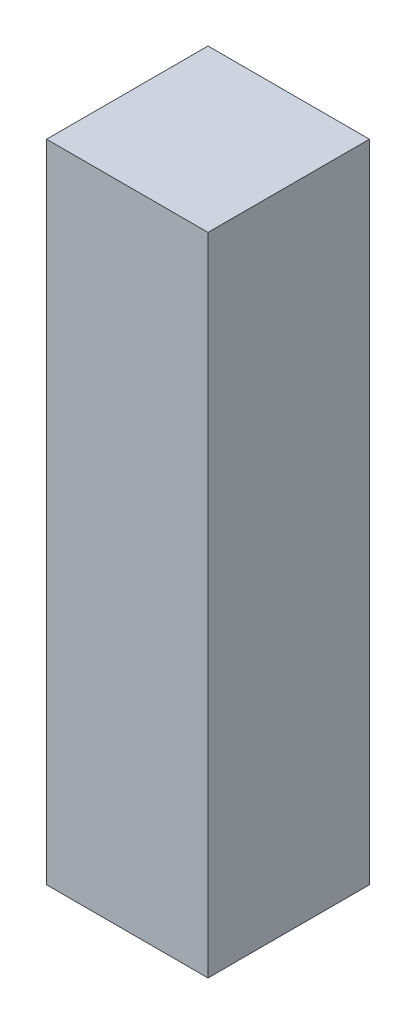
ISO-10303-21;
HEADER;
FILE_DESCRIPTION(('STEP AP214'),'2;1');
FILE_NAME('part.step','',(''),(''),'','','');
FILE_SCHEMA(('AUTOMOTIVE_DESIGN { 1 0 10303 214 1 1 1 1 }'));
ENDSEC;
DATA;
#1=APPLICATION_CONTEXT('core data for automotive mechanical design processes');
#2=APPLICATION_PROTOCOL_DEFINITION('international standard','automotive_design',2000,#1);
#3=PRODUCT_CONTEXT('',#1,'mechanical');
#4=PRODUCT('Part','Part','',(#3));
#5=PRODUCT_RELATED_PRODUCT_CATEGORY('part','',(#4));
#6=PRODUCT_DEFINITION_FORMATION('','',#4);
#7=PRODUCT_DEFINITION_CONTEXT('part definition',#1,'design');
#8=PRODUCT_DEFINITION('design','',#6,#7);
#9=PRODUCT_DEFINITION_SHAPE('','',#8);
#10=(LENGTH_UNIT() NAMED_UNIT(*) SI_UNIT(.MILLI.,.METRE.));
#11=(NAMED_UNIT(*) PLANE_ANGLE_UNIT() SI_UNIT($,.RADIAN.));
#12=(NAMED_UNIT(*) SI_UNIT($,.STERADIAN.) SOLID_ANGLE_UNIT());
#13=UNCERTAINTY_MEASURE_WITH_UNIT(LENGTH_MEASURE(1.E-05),#10,'distance_accuracy_value','');
#14=(GEOMETRIC_REPRESENTATION_CONTEXT(3) GLOBAL_UNCERTAINTY_ASSIGNED_CONTEXT((#13)) GLOBAL_UNIT_ASSIGNED_CONTEXT((#10,
#11,#12)) REPRESENTATION_CONTEXT('',''));
#15=CARTESIAN_POINT('',(0.,0.,0.));
#16=DIRECTION('',(0.,0.,1.));
#17=DIRECTION('',(1.,0.,0.));
#18=AXIS2_PLACEMENT_3D('',#15,#16,#17);
#19=CARTESIAN_POINT('',(-19.05,152.4,19.05));
#20=DIRECTION('',(1.,0.,0.));
#21=DIRECTION('',(0.,0.,-1.));
#22=AXIS2_PLACEMENT_3D('',#19,#20,#21);
#23=PLANE('',#22);
#24=DIRECTION('',(0.,0.,1.));
#25=VECTOR('',#24,1.);
#26=CARTESIAN_POINT('',(-19.05,0.,19.05));
#27=LINE('',#26,#25);
#28=CARTESIAN_POINT('',(-19.05,0.,-19.05));
#29=VERTEX_POINT('',#28);
#30=CARTESIAN_POINT('',(-19.05,0.,19.05));
#31=VERTEX_POINT('',#30);
#32=EDGE_CURVE('E98',#29,#31,#27,.T.);
#33=ORIENTED_EDGE('',*,*,#32,.T.);
#34=DIRECTION('',(0.,-1.,0.));
#35=VECTOR('',#34,1.);
#36=CARTESIAN_POINT('',(-19.05,152.4,19.05));
#37=LINE('',#36,#35);
#38=CARTESIAN_POINT('',(-19.05,152.4,19.05));
#39=VERTEX_POINT('',#38);
#40=EDGE_CURVE('E11',#39,#31,#37,.T.);
#41=ORIENTED_EDGE('',*,*,#40,.F.);
#42=DIRECTION('',(0.,0.,1.));
#43=VECTOR('',#42,1.);
#44=CARTESIAN_POINT('',(-19.05,152.4,19.05));
#45=LINE('',#44,#43);
#46=CARTESIAN_POINT('',(-19.05,152.4,-19.05));
#47=VERTEX_POINT('',#46);
#48=EDGE_CURVE('E86',#47,#39,#45,.T.);
#49=ORIENTED_EDGE('',*,*,#48,.F.);
#50=DIRECTION('',(0.,-1.,0.));
#51=VECTOR('',#50,1.);
#52=CARTESIAN_POINT('',(-19.05,152.4,-19.05));
#53=LINE('',#52,#51);
#54=EDGE_CURVE('E94',#47,#29,#53,.T.);
#55=ORIENTED_EDGE('',*,*,#54,.T.);
#56=EDGE_LOOP('',(#33,#41,#49,#55));
#57=FACE_BOUND('',#56,.T.);
#58=ADVANCED_FACE('F35',(#57),#23,.F.);
#59=CARTESIAN_POINT('',(19.05,152.4,19.05));
#60=DIRECTION('',(0.,0.,-1.));
#61=DIRECTION('',(-1.,0.,0.));
#62=AXIS2_PLACEMENT_3D('',#59,#60,#61);
#63=PLANE('',#62);
#64=DIRECTION('',(1.,0.,0.));
#65=VECTOR('',#64,1.);
#66=CARTESIAN_POINT('',(19.05,0.,19.05));
#67=LINE('',#66,#65);
#68=CARTESIAN_POINT('',(19.05,0.,19.05));
#69=VERTEX_POINT('',#68);
#70=EDGE_CURVE('E90',#31,#69,#67,.T.);
#71=ORIENTED_EDGE('',*,*,#70,.T.);
#72=DIRECTION('',(0.,-1.,0.));
#73=VECTOR('',#72,1.);
#74=CARTESIAN_POINT('',(19.05,152.4,19.05));
#75=LINE('',#74,#73);
#76=CARTESIAN_POINT('',(19.05,152.4,19.05));
#77=VERTEX_POINT('',#76);
#78=EDGE_CURVE('E43',#77,#69,#75,.T.);
#79=ORIENTED_EDGE('',*,*,#78,.F.);
#80=DIRECTION('',(1.,0.,0.));
#81=VECTOR('',#80,1.);
#82=CARTESIAN_POINT('',(19.05,152.4,19.05));
#83=LINE('',#82,#81);
#84=EDGE_CURVE('E81',#39,#77,#83,.T.);
#85=ORIENTED_EDGE('',*,*,#84,.F.);
#86=ORIENTED_EDGE('',*,*,#40,.T.);
#87=EDGE_LOOP('',(#71,#79,#85,#86));
#88=FACE_BOUND('',#87,.T.);
#89=ADVANCED_FACE('F89',(#88),#63,.F.);
#90=CARTESIAN_POINT('',(19.05,152.4,19.05));
#91=DIRECTION('',(-1.,0.,0.));
#92=DIRECTION('',(0.,0.,1.));
#93=AXIS2_PLACEMENT_3D('',#90,#91,#92);
#94=PLANE('',#93);
#95=DIRECTION('',(0.,0.,-1.));
#96=VECTOR('',#95,1.);
#97=CARTESIAN_POINT('',(19.05,0.,19.05));
#98=LINE('',#97,#96);
#99=CARTESIAN_POINT('',(19.05,0.,-19.05));
#100=VERTEX_POINT('',#99);
#101=EDGE_CURVE('E68',#69,#100,#98,.T.);
#102=ORIENTED_EDGE('',*,*,#101,.T.);
#103=DIRECTION('',(0.,-1.,0.));
#104=VECTOR('',#103,1.);
#105=CARTESIAN_POINT('',(19.05,152.4,-19.05));
#106=LINE('',#105,#104);
#107=CARTESIAN_POINT('',(19.05,152.4,-19.05));
#108=VERTEX_POINT('',#107);
#109=EDGE_CURVE('E91',#108,#100,#106,.T.);
#110=ORIENTED_EDGE('',*,*,#109,.F.);
#111=DIRECTION('',(0.,0.,-1.));
#112=VECTOR('',#111,1.);
#113=CARTESIAN_POINT('',(19.05,152.4,19.05));
#114=LINE('',#113,#112);
#115=EDGE_CURVE('E84',#77,#108,#114,.T.);
#116=ORIENTED_EDGE('',*,*,#115,.F.);
#117=ORIENTED_EDGE('',*,*,#78,.T.);
#118=EDGE_LOOP('',(#102,#110,#116,#117));
#119=FACE_BOUND('',#118,.T.);
#120=ADVANCED_FACE('F92',(#119),#94,.F.);
#121=CARTESIAN_POINT('',(19.05,152.4,-19.05));
#122=DIRECTION('',(0.,0.,1.));
#123=DIRECTION('',(1.,0.,0.));
#124=AXIS2_PLACEMENT_3D('',#121,#122,#123);
#125=PLANE('',#124);
#126=DIRECTION('',(-1.,0.,0.));
#127=VECTOR('',#126,1.);
#128=CARTESIAN_POINT('',(19.05,0.,-19.05));
#129=LINE('',#128,#127);
#130=EDGE_CURVE('E74',#100,#29,#129,.T.);
#131=ORIENTED_EDGE('',*,*,#130,.T.);
#132=ORIENTED_EDGE('',*,*,#54,.F.);
#133=DIRECTION('',(-1.,0.,0.));
#134=VECTOR('',#133,1.);
#135=CARTESIAN_POINT('',(19.05,152.4,-19.05));
#136=LINE('',#135,#134);
#137=EDGE_CURVE('E51',#108,#47,#136,.T.);
#138=ORIENTED_EDGE('',*,*,#137,.F.);
#139=ORIENTED_EDGE('',*,*,#109,.T.);
#140=EDGE_LOOP('',(#131,#132,#138,#139));
#141=FACE_BOUND('',#140,.T.);
#142=ADVANCED_FACE('F105',(#141),#125,.F.);
#143=CARTESIAN_POINT('',(0.,152.4,0.));
#144=DIRECTION('',(0.,1.,0.));
#145=DIRECTION('',(0.,0.,1.));
#146=AXIS2_PLACEMENT_3D('',#143,#144,#145);
#147=PLANE('',#146);
#148=ORIENTED_EDGE('',*,*,#48,.T.);
#149=ORIENTED_EDGE('',*,*,#84,.T.);
#150=ORIENTED_EDGE('',*,*,#115,.T.);
#151=ORIENTED_EDGE('',*,*,#137,.T.);
#152=EDGE_LOOP('',(#148,#149,#150,#151));
#153=FACE_BOUND('',#152,.T.);
#154=ADVANCED_FACE('F82',(#153),#147,.T.);
#155=CARTESIAN_POINT('',(0.,0.,0.));
#156=DIRECTION('',(0.,1.,0.));
#157=DIRECTION('',(0.,0.,1.));
#158=AXIS2_PLACEMENT_3D('',#155,#156,#157);
#159=PLANE('',#158);
#160=ORIENTED_EDGE('',*,*,#32,.F.);
#161=ORIENTED_EDGE('',*,*,#130,.F.);
#162=ORIENTED_EDGE('',*,*,#101,.F.);
#163=ORIENTED_EDGE('',*,*,#70,.F.);
#164=EDGE_LOOP('',(#160,#161,#162,#163));
#165=FACE_BOUND('',#164,.T.);
#166=ADVANCED_FACE('F108',(#165),#159,.F.);
#167=CLOSED_SHELL('',(#58,#89,#120,#142,#154,#166));
#168=MANIFOLD_SOLID_BREP('B2',#167);
#169=ADVANCED_BREP_SHAPE_REPRESENTATION('',(#18,#168),#14);
#170=SHAPE_DEFINITION_REPRESENTATION(#9,#169);
ENDSEC;
END-ISO-10303-21;
